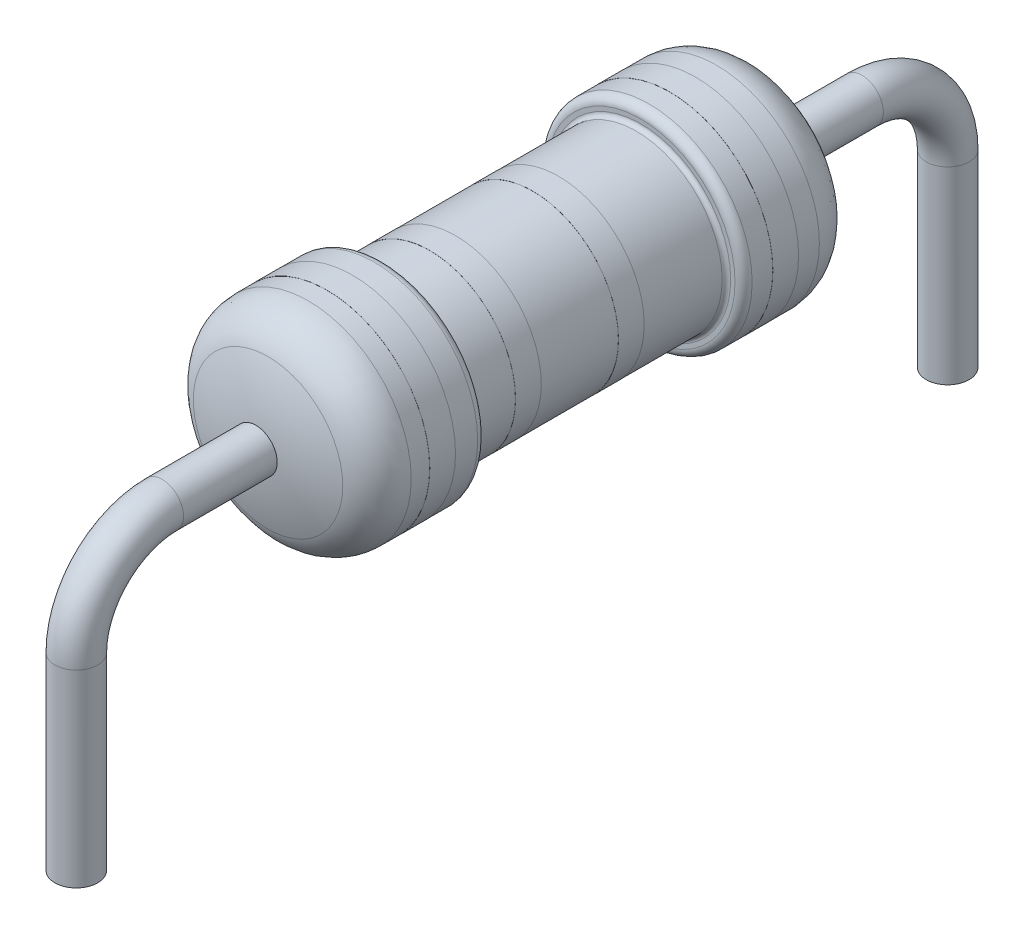
ISO-10303-21;
HEADER;
FILE_DESCRIPTION(('STEP AP214'),'2;1');
FILE_NAME('part.step','',(''),(''),'','','');
FILE_SCHEMA(('AUTOMOTIVE_DESIGN { 1 0 10303 214 1 1 1 1 }'));
ENDSEC;
DATA;
#1=APPLICATION_CONTEXT('core data for automotive mechanical design processes');
#2=APPLICATION_PROTOCOL_DEFINITION('international standard','automotive_design',2000,#1);
#3=PRODUCT_CONTEXT('',#1,'mechanical');
#4=PRODUCT('Part','Part','',(#3));
#5=PRODUCT_RELATED_PRODUCT_CATEGORY('part','',(#4));
#6=PRODUCT_DEFINITION_FORMATION('','',#4);
#7=PRODUCT_DEFINITION_CONTEXT('part definition',#1,'design');
#8=PRODUCT_DEFINITION('design','',#6,#7);
#9=PRODUCT_DEFINITION_SHAPE('','',#8);
#10=(LENGTH_UNIT() NAMED_UNIT(*) SI_UNIT(.MILLI.,.METRE.));
#11=(NAMED_UNIT(*) PLANE_ANGLE_UNIT() SI_UNIT($,.RADIAN.));
#12=(NAMED_UNIT(*) SI_UNIT($,.STERADIAN.) SOLID_ANGLE_UNIT());
#13=UNCERTAINTY_MEASURE_WITH_UNIT(LENGTH_MEASURE(1.E-05),#10,'distance_accuracy_value','');
#14=(GEOMETRIC_REPRESENTATION_CONTEXT(3) GLOBAL_UNCERTAINTY_ASSIGNED_CONTEXT((#13)) GLOBAL_UNIT_ASSIGNED_CONTEXT((#10,
#11,#12)) REPRESENTATION_CONTEXT('',''));
#15=CARTESIAN_POINT('',(0.,0.,0.));
#16=DIRECTION('',(0.,0.,1.));
#17=DIRECTION('',(1.,0.,0.));
#18=AXIS2_PLACEMENT_3D('',#15,#16,#17);
#19=CARTESIAN_POINT('',(0.,0.,13.0537184677986));
#20=DIRECTION('',(0.,0.,1.));
#21=DIRECTION('',(1.,0.,0.));
#22=AXIS2_PLACEMENT_3D('',#19,#20,#21);
#23=CYLINDRICAL_SURFACE('',#22,1.);
#24=CARTESIAN_POINT('',(0.,0.,-2.5));
#25=DIRECTION('',(0.,0.,1.));
#26=DIRECTION('',(1.,0.,0.));
#27=AXIS2_PLACEMENT_3D('',#24,#25,#26);
#28=CIRCLE('',#27,1.);
#29=CARTESIAN_POINT('',(1.,0.,-2.5));
#30=VERTEX_POINT('',#29);
#31=EDGE_CURVE('E627',#30,#30,#28,.T.);
#32=ORIENTED_EDGE('',*,*,#31,.T.);
#33=EDGE_LOOP('',(#32));
#34=FACE_BOUND('',#33,.T.);
#35=CARTESIAN_POINT('',(0.,0.,-1.6));
#36=DIRECTION('',(0.,0.,1.));
#37=DIRECTION('',(1.,0.,0.));
#38=AXIS2_PLACEMENT_3D('',#35,#36,#37);
#39=CIRCLE('',#38,1.);
#40=CARTESIAN_POINT('',(1.,0.,-1.6));
#41=VERTEX_POINT('',#40);
#42=EDGE_CURVE('E60',#41,#41,#39,.T.);
#43=ORIENTED_EDGE('',*,*,#42,.F.);
#44=EDGE_LOOP('',(#43));
#45=FACE_BOUND('',#44,.T.);
#46=ADVANCED_FACE('F50',(#34,#45),#23,.T.);
#47=CARTESIAN_POINT('',(0.,0.,-1.6));
#48=DIRECTION('',(0.,0.,1.));
#49=DIRECTION('',(1.,0.,0.));
#50=AXIS2_PLACEMENT_3D('',#47,#48,#49);
#51=CYLINDRICAL_SURFACE('',#50,1.001);
#52=CARTESIAN_POINT('',(0.,0.,-1.6));
#53=DIRECTION('',(0.,0.,1.));
#54=DIRECTION('',(1.,0.,0.));
#55=AXIS2_PLACEMENT_3D('',#52,#53,#54);
#56=CIRCLE('',#55,1.001);
#57=CARTESIAN_POINT('',(1.001,0.,-1.6));
#58=VERTEX_POINT('',#57);
#59=EDGE_CURVE('E296',#58,#58,#56,.T.);
#60=ORIENTED_EDGE('',*,*,#59,.T.);
#61=EDGE_LOOP('',(#60));
#62=FACE_BOUND('',#61,.T.);
#63=CARTESIAN_POINT('',(0.,0.,-1.3));
#64=DIRECTION('',(0.,0.,1.));
#65=DIRECTION('',(1.,0.,0.));
#66=AXIS2_PLACEMENT_3D('',#63,#64,#65);
#67=CIRCLE('',#66,1.001);
#68=CARTESIAN_POINT('',(1.001,0.,-1.3));
#69=VERTEX_POINT('',#68);
#70=EDGE_CURVE('E298',#69,#69,#67,.T.);
#71=ORIENTED_EDGE('',*,*,#70,.F.);
#72=EDGE_LOOP('',(#71));
#73=FACE_BOUND('',#72,.T.);
#74=ADVANCED_FACE('F212',(#62,#73),#51,.T.);
#75=CARTESIAN_POINT('',(0.,0.,-1.6));
#76=DIRECTION('',(0.,0.,1.));
#77=DIRECTION('',(1.,0.,0.));
#78=AXIS2_PLACEMENT_3D('',#75,#76,#77);
#79=PLANE('',#78);
#80=ORIENTED_EDGE('',*,*,#42,.T.);
#81=EDGE_LOOP('',(#80));
#82=FACE_BOUND('',#81,.T.);
#83=ORIENTED_EDGE('',*,*,#59,.F.);
#84=EDGE_LOOP('',(#83));
#85=FACE_BOUND('',#84,.T.);
#86=ADVANCED_FACE('F215',(#82,#85),#79,.F.);
#87=CARTESIAN_POINT('',(0.,0.,-1.3));
#88=DIRECTION('',(0.,0.,1.));
#89=DIRECTION('',(1.,0.,0.));
#90=AXIS2_PLACEMENT_3D('',#87,#88,#89);
#91=PLANE('',#90);
#92=CARTESIAN_POINT('',(0.,0.,-1.3));
#93=DIRECTION('',(0.,0.,1.));
#94=DIRECTION('',(1.,0.,0.));
#95=AXIS2_PLACEMENT_3D('',#92,#93,#94);
#96=CIRCLE('',#95,1.);
#97=CARTESIAN_POINT('',(1.,0.,-1.3));
#98=VERTEX_POINT('',#97);
#99=EDGE_CURVE('E306',#98,#98,#96,.T.);
#100=ORIENTED_EDGE('',*,*,#99,.F.);
#101=EDGE_LOOP('',(#100));
#102=FACE_BOUND('',#101,.T.);
#103=ORIENTED_EDGE('',*,*,#70,.T.);
#104=EDGE_LOOP('',(#103));
#105=FACE_BOUND('',#104,.T.);
#106=ADVANCED_FACE('F167',(#102,#105),#91,.T.);
#107=CARTESIAN_POINT('',(0.,-3.2,2.82076049666258));
#108=DIRECTION('',(0.,-1.,0.));
#109=DIRECTION('',(0.,0.,-1.));
#110=AXIS2_PLACEMENT_3D('',#107,#108,#109);
#111=PLANE('',#110);
#112=CARTESIAN_POINT('',(0.,-3.2,2.82076049666258));
#113=DIRECTION('',(0.,-1.,0.));
#114=DIRECTION('',(0.,0.,-1.));
#115=AXIS2_PLACEMENT_3D('',#112,#113,#114);
#116=CIRCLE('',#115,0.25);
#117=CARTESIAN_POINT('',(0.,-3.2,2.57076049666258));
#118=VERTEX_POINT('',#117);
#119=EDGE_CURVE('E65',#118,#118,#116,.T.);
#120=ORIENTED_EDGE('',*,*,#119,.T.);
#121=EDGE_LOOP('',(#120));
#122=FACE_BOUND('',#121,.T.);
#123=ADVANCED_FACE('F163',(#122),#111,.T.);
#124=CARTESIAN_POINT('',(0.,-3.2,2.82076049666258));
#125=DIRECTION('',(0.,1.,0.));
#126=DIRECTION('',(0.,0.,1.));
#127=AXIS2_PLACEMENT_3D('',#124,#125,#126);
#128=CYLINDRICAL_SURFACE('',#127,0.25);
#129=CARTESIAN_POINT('',(0.,-1.,2.82076049666258));
#130=DIRECTION('',(0.,-1.,0.));
#131=DIRECTION('',(0.,0.,-1.));
#132=AXIS2_PLACEMENT_3D('',#129,#130,#131);
#133=CIRCLE('',#132,0.25);
#134=CARTESIAN_POINT('',(0.,-1.,3.07076049666258));
#135=VERTEX_POINT('',#134);
#136=EDGE_CURVE('E332',#135,#135,#133,.T.);
#137=ORIENTED_EDGE('',*,*,#136,.T.);
#138=EDGE_LOOP('',(#137));
#139=FACE_BOUND('',#138,.T.);
#140=ORIENTED_EDGE('',*,*,#119,.F.);
#141=EDGE_LOOP('',(#140));
#142=FACE_BOUND('',#141,.T.);
#143=ADVANCED_FACE('F166',(#139,#142),#128,.T.);
#144=CARTESIAN_POINT('',(0.,-1.,1.82076049666258));
#145=DIRECTION('',(-1.,0.,0.));
#146=DIRECTION('',(0.,0.,1.));
#147=AXIS2_PLACEMENT_3D('',#144,#145,#146);
#148=TOROIDAL_SURFACE('',#147,1.,0.25);
#149=CARTESIAN_POINT('',(0.,0.,1.82076049666258));
#150=DIRECTION('',(0.,0.,1.));
#151=DIRECTION('',(0.,-1.,0.));
#152=AXIS2_PLACEMENT_3D('',#149,#150,#151);
#153=CIRCLE('',#152,0.25);
#154=CARTESIAN_POINT('',(0.,0.25,1.82076049666258));
#155=VERTEX_POINT('',#154);
#156=EDGE_CURVE('E336',#155,#155,#153,.T.);
#157=CARTESIAN_POINT('',(0.,-1.,1.82076049666258));
#158=DIRECTION('',(-1.,0.,0.));
#159=DIRECTION('',(0.,0.,1.));
#160=AXIS2_PLACEMENT_3D('',#157,#158,#159);
#161=CIRCLE('',#160,1.25);
#162=EDGE_CURVE('',#135,#155,#161,.T.);
#163=ORIENTED_EDGE('',*,*,#136,.F.);
#164=ORIENTED_EDGE('',*,*,#156,.T.);
#165=ORIENTED_EDGE('',*,*,#162,.T.);
#166=ORIENTED_EDGE('',*,*,#162,.F.);
#167=EDGE_LOOP('',(#163,#165,#164,#166));
#168=FACE_BOUND('',#167,.T.);
#169=ADVANCED_FACE('F182',(#168),#148,.T.);
#170=CARTESIAN_POINT('',(0.,0.,1.82076049666258));
#171=DIRECTION('',(0.,0.,-1.));
#172=DIRECTION('',(-1.,0.,0.));
#173=AXIS2_PLACEMENT_3D('',#170,#171,#172);
#174=CYLINDRICAL_SURFACE('',#173,0.25);
#175=ORIENTED_EDGE('',*,*,#156,.F.);
#176=EDGE_LOOP('',(#175));
#177=FACE_BOUND('',#176,.T.);
#178=CARTESIAN_POINT('',(0.,0.,0.728355418308152));
#179=DIRECTION('',(0.,0.,1.));
#180=DIRECTION('',(1.,0.,0.));
#181=AXIS2_PLACEMENT_3D('',#178,#179,#180);
#182=CIRCLE('',#181,0.25);
#183=CARTESIAN_POINT('',(0.25,0.,0.728355418308152));
#184=VERTEX_POINT('',#183);
#185=EDGE_CURVE('E89',#184,#184,#182,.T.);
#186=ORIENTED_EDGE('',*,*,#185,.T.);
#187=EDGE_LOOP('',(#186));
#188=FACE_BOUND('',#187,.T.);
#189=ADVANCED_FACE('F179',(#177,#188),#174,.T.);
#190=CARTESIAN_POINT('',(0.,0.871405633632315,0.585255019027252));
#191=CARTESIAN_POINT('',(0.,0.729361961211136,0.637090178239435));
#192=CARTESIAN_POINT('',(0.,0.44208401652609,0.714842917055385));
#193=CARTESIAN_POINT('',(0.,0.148424872124987,0.740760496662583));
#194=CARTESIAN_POINT('',(0.,0.,0.740760496662583));
#195=B_SPLINE_CURVE_WITH_KNOTS('',3,(#190,#191,#192,#193,#194),.UNSPECIFIED.,.F.,.F.,(4,1,4),
(0.,0.359983191317716,0.719966382635432),.UNSPECIFIED.);
#196=CARTESIAN_POINT('',(0.,0.,13.0537184677986));
#197=DIRECTION('',(0.,0.,1.));
#198=AXIS1_PLACEMENT('',#196,#197);
#199=SURFACE_OF_REVOLUTION('',#195,#198);
#200=CARTESIAN_POINT('',(0.,0.,0.585255019027252));
#201=DIRECTION('',(0.,0.,1.));
#202=DIRECTION('',(1.,0.,0.));
#203=AXIS2_PLACEMENT_3D('',#200,#201,#202);
#204=CIRCLE('',#203,0.871405633632315);
#205=CARTESIAN_POINT('',(0.871405633632315,0.,0.585255019027252));
#206=VERTEX_POINT('',#205);
#207=EDGE_CURVE('E74',#206,#206,#204,.T.);
#208=ORIENTED_EDGE('',*,*,#207,.T.);
#209=EDGE_LOOP('',(#208));
#210=FACE_BOUND('',#209,.T.);
#211=ORIENTED_EDGE('',*,*,#185,.F.);
#212=EDGE_LOOP('',(#211));
#213=FACE_BOUND('',#212,.T.);
#214=ADVANCED_FACE('F52',(#210,#213),#199,.T.);
#215=CARTESIAN_POINT('',(0.,0.,0.115552870044405));
#216=DIRECTION('',(0.,0.,1.));
#217=DIRECTION('',(1.,0.,0.));
#218=AXIS2_PLACEMENT_3D('',#215,#216,#217);
#219=TOROIDAL_SURFACE('',#218,0.7,0.5);
#220=ORIENTED_EDGE('',*,*,#207,.F.);
#221=EDGE_LOOP('',(#220));
#222=FACE_BOUND('',#221,.T.);
#223=CARTESIAN_POINT('',(0.,0.,0.115552870044404));
#224=DIRECTION('',(0.,0.,1.));
#225=DIRECTION('',(1.,0.,0.));
#226=AXIS2_PLACEMENT_3D('',#223,#224,#225);
#227=CIRCLE('',#226,1.2);
#228=CARTESIAN_POINT('',(1.2,0.,0.115552870044404));
#229=VERTEX_POINT('',#228);
#230=EDGE_CURVE('E81',#229,#229,#227,.T.);
#231=ORIENTED_EDGE('',*,*,#230,.T.);
#232=EDGE_LOOP('',(#231));
#233=FACE_BOUND('',#232,.T.);
#234=ADVANCED_FACE('F158',(#222,#233),#219,.T.);
#235=CARTESIAN_POINT('',(0.,0.,13.0537184677986));
#236=DIRECTION('',(0.,0.,1.));
#237=DIRECTION('',(1.,0.,0.));
#238=AXIS2_PLACEMENT_3D('',#235,#236,#237);
#239=CYLINDRICAL_SURFACE('',#238,1.2);
#240=CARTESIAN_POINT('',(0.,0.,-0.1));
#241=DIRECTION('',(0.,0.,1.));
#242=DIRECTION('',(1.,0.,0.));
#243=AXIS2_PLACEMENT_3D('',#240,#241,#242);
#244=CIRCLE('',#243,1.2);
#245=CARTESIAN_POINT('',(1.2,0.,-0.1));
#246=VERTEX_POINT('',#245);
#247=EDGE_CURVE('E315',#246,#246,#244,.T.);
#248=ORIENTED_EDGE('',*,*,#247,.T.);
#249=EDGE_LOOP('',(#248));
#250=FACE_BOUND('',#249,.T.);
#251=ORIENTED_EDGE('',*,*,#230,.F.);
#252=EDGE_LOOP('',(#251));
#253=FACE_BOUND('',#252,.T.);
#254=ADVANCED_FACE('F154',(#250,#253),#239,.T.);
#255=CARTESIAN_POINT('',(0.,0.,-0.1));
#256=DIRECTION('',(0.,0.,1.));
#257=DIRECTION('',(1.,0.,0.));
#258=AXIS2_PLACEMENT_3D('',#255,#256,#257);
#259=PLANE('',#258);
#260=ORIENTED_EDGE('',*,*,#247,.F.);
#261=EDGE_LOOP('',(#260));
#262=FACE_BOUND('',#261,.T.);
#263=CARTESIAN_POINT('',(0.,0.,-0.1));
#264=DIRECTION('',(0.,0.,1.));
#265=DIRECTION('',(1.,0.,0.));
#266=AXIS2_PLACEMENT_3D('',#263,#264,#265);
#267=CIRCLE('',#266,1.201);
#268=CARTESIAN_POINT('',(1.201,0.,-0.1));
#269=VERTEX_POINT('',#268);
#270=EDGE_CURVE('E322',#269,#269,#267,.T.);
#271=ORIENTED_EDGE('',*,*,#270,.T.);
#272=EDGE_LOOP('',(#271));
#273=FACE_BOUND('',#272,.T.);
#274=ADVANCED_FACE('F157',(#262,#273),#259,.T.);
#275=CARTESIAN_POINT('',(0.,0.,-0.4));
#276=DIRECTION('',(0.,0.,1.));
#277=DIRECTION('',(1.,0.,0.));
#278=AXIS2_PLACEMENT_3D('',#275,#276,#277);
#279=CYLINDRICAL_SURFACE('',#278,1.201);
#280=CARTESIAN_POINT('',(0.,0.,-0.4));
#281=DIRECTION('',(0.,0.,1.));
#282=DIRECTION('',(1.,0.,0.));
#283=AXIS2_PLACEMENT_3D('',#280,#281,#282);
#284=CIRCLE('',#283,1.201);
#285=CARTESIAN_POINT('',(1.201,0.,-0.4));
#286=VERTEX_POINT('',#285);
#287=EDGE_CURVE('E323',#286,#286,#284,.T.);
#288=ORIENTED_EDGE('',*,*,#287,.T.);
#289=EDGE_LOOP('',(#288));
#290=FACE_BOUND('',#289,.T.);
#291=ORIENTED_EDGE('',*,*,#270,.F.);
#292=EDGE_LOOP('',(#291));
#293=FACE_BOUND('',#292,.T.);
#294=ADVANCED_FACE('F190',(#290,#293),#279,.T.);
#295=CARTESIAN_POINT('',(0.,0.,-0.4));
#296=DIRECTION('',(0.,0.,1.));
#297=DIRECTION('',(1.,0.,0.));
#298=AXIS2_PLACEMENT_3D('',#295,#296,#297);
#299=PLANE('',#298);
#300=CARTESIAN_POINT('',(0.,0.,-0.399999999999999));
#301=DIRECTION('',(0.,0.,1.));
#302=DIRECTION('',(1.,0.,0.));
#303=AXIS2_PLACEMENT_3D('',#300,#301,#302);
#304=CIRCLE('',#303,1.2);
#305=CARTESIAN_POINT('',(1.2,0.,-0.399999999999999));
#306=VERTEX_POINT('',#305);
#307=EDGE_CURVE('E92',#306,#306,#304,.T.);
#308=ORIENTED_EDGE('',*,*,#307,.T.);
#309=EDGE_LOOP('',(#308));
#310=FACE_BOUND('',#309,.T.);
#311=ORIENTED_EDGE('',*,*,#287,.F.);
#312=EDGE_LOOP('',(#311));
#313=FACE_BOUND('',#312,.T.);
#314=ADVANCED_FACE('F193',(#310,#313),#299,.F.);
#315=CARTESIAN_POINT('',(0.,0.,-0.659239503337416));
#316=DIRECTION('',(0.,0.,1.));
#317=DIRECTION('',(1.,0.,0.));
#318=AXIS2_PLACEMENT_3D('',#315,#316,#317);
#319=CIRCLE('',#318,1.2);
#320=CARTESIAN_POINT('',(1.2,0.,-0.659239503337416));
#321=VERTEX_POINT('',#320);
#322=EDGE_CURVE('E600',#321,#321,#319,.T.);
#323=ORIENTED_EDGE('',*,*,#322,.T.);
#324=EDGE_LOOP('',(#323));
#325=FACE_BOUND('',#324,.T.);
#326=ORIENTED_EDGE('',*,*,#307,.F.);
#327=EDGE_LOOP('',(#326));
#328=FACE_BOUND('',#327,.T.);
#329=ADVANCED_FACE('F152',(#325,#328),#239,.T.);
#330=CARTESIAN_POINT('',(0.,0.,-0.659239503337417));
#331=DIRECTION('',(0.,0.,1.));
#332=DIRECTION('',(1.,0.,0.));
#333=AXIS2_PLACEMENT_3D('',#330,#331,#332);
#334=TOROIDAL_SURFACE('',#333,1.1,0.1);
#335=ORIENTED_EDGE('',*,*,#322,.F.);
#336=EDGE_LOOP('',(#335));
#337=FACE_BOUND('',#336,.T.);
#338=CARTESIAN_POINT('',(0.,0.,-0.759239503337417));
#339=DIRECTION('',(0.,0.,1.));
#340=DIRECTION('',(1.,0.,0.));
#341=AXIS2_PLACEMENT_3D('',#338,#339,#340);
#342=CIRCLE('',#341,1.1);
#343=CARTESIAN_POINT('',(1.1,0.,-0.759239503337417));
#344=VERTEX_POINT('',#343);
#345=EDGE_CURVE('E603',#344,#344,#342,.T.);
#346=ORIENTED_EDGE('',*,*,#345,.T.);
#347=EDGE_LOOP('',(#346));
#348=FACE_BOUND('',#347,.T.);
#349=ADVANCED_FACE('F148',(#337,#348),#334,.T.);
#350=CARTESIAN_POINT('',(0.,1.05,-0.759239503337417));
#351=DIRECTION('',(0.,0.,1.));
#352=DIRECTION('',(1.,0.,0.));
#353=AXIS2_PLACEMENT_3D('',#350,#351,#352);
#354=PLANE('',#353);
#355=ORIENTED_EDGE('',*,*,#345,.F.);
#356=EDGE_LOOP('',(#355));
#357=FACE_BOUND('',#356,.T.);
#358=CARTESIAN_POINT('',(0.,0.,-0.759239503337417));
#359=DIRECTION('',(0.,0.,1.));
#360=DIRECTION('',(1.,0.,0.));
#361=AXIS2_PLACEMENT_3D('',#358,#359,#360);
#362=CIRCLE('',#361,1.05);
#363=CARTESIAN_POINT('',(1.05,0.,-0.759239503337417));
#364=VERTEX_POINT('',#363);
#365=EDGE_CURVE('E261',#364,#364,#362,.T.);
#366=ORIENTED_EDGE('',*,*,#365,.T.);
#367=EDGE_LOOP('',(#366));
#368=FACE_BOUND('',#367,.T.);
#369=ADVANCED_FACE('F144',(#357,#368),#354,.F.);
#370=CARTESIAN_POINT('',(0.,0.,-0.809239503337417));
#371=DIRECTION('',(0.,0.,1.));
#372=DIRECTION('',(1.,0.,0.));
#373=AXIS2_PLACEMENT_3D('',#370,#371,#372);
#374=TOROIDAL_SURFACE('',#373,1.05,0.05);
#375=ORIENTED_EDGE('',*,*,#365,.F.);
#376=EDGE_LOOP('',(#375));
#377=FACE_BOUND('',#376,.T.);
#378=CARTESIAN_POINT('',(0.,0.,-0.809239503337417));
#379=DIRECTION('',(0.,0.,1.));
#380=DIRECTION('',(1.,0.,0.));
#381=AXIS2_PLACEMENT_3D('',#378,#379,#380);
#382=CIRCLE('',#381,1.);
#383=CARTESIAN_POINT('',(1.,0.,-0.809239503337417));
#384=VERTEX_POINT('',#383);
#385=EDGE_CURVE('E252',#384,#384,#382,.T.);
#386=ORIENTED_EDGE('',*,*,#385,.T.);
#387=EDGE_LOOP('',(#386));
#388=FACE_BOUND('',#387,.T.);
#389=ADVANCED_FACE('F140',(#377,#388),#374,.F.);
#390=ORIENTED_EDGE('',*,*,#99,.T.);
#391=EDGE_LOOP('',(#390));
#392=FACE_BOUND('',#391,.T.);
#393=ORIENTED_EDGE('',*,*,#385,.F.);
#394=EDGE_LOOP('',(#393));
#395=FACE_BOUND('',#394,.T.);
#396=ADVANCED_FACE('F136',(#392,#395),#23,.T.);
#397=CARTESIAN_POINT('',(0.,0.,-2.8));
#398=DIRECTION('',(0.,0.,1.));
#399=DIRECTION('',(1.,0.,0.));
#400=AXIS2_PLACEMENT_3D('',#397,#398,#399);
#401=CYLINDRICAL_SURFACE('',#400,1.001);
#402=CARTESIAN_POINT('',(0.,0.,-2.8));
#403=DIRECTION('',(0.,0.,1.));
#404=DIRECTION('',(1.,0.,0.));
#405=AXIS2_PLACEMENT_3D('',#402,#403,#404);
#406=CIRCLE('',#405,1.001);
#407=CARTESIAN_POINT('',(1.001,0.,-2.8));
#408=VERTEX_POINT('',#407);
#409=EDGE_CURVE('E619',#408,#408,#406,.T.);
#410=ORIENTED_EDGE('',*,*,#409,.T.);
#411=EDGE_LOOP('',(#410));
#412=FACE_BOUND('',#411,.T.);
#413=CARTESIAN_POINT('',(0.,0.,-2.5));
#414=DIRECTION('',(0.,0.,1.));
#415=DIRECTION('',(1.,0.,0.));
#416=AXIS2_PLACEMENT_3D('',#413,#414,#415);
#417=CIRCLE('',#416,1.001);
#418=CARTESIAN_POINT('',(1.001,0.,-2.5));
#419=VERTEX_POINT('',#418);
#420=EDGE_CURVE('E622',#419,#419,#417,.T.);
#421=ORIENTED_EDGE('',*,*,#420,.F.);
#422=EDGE_LOOP('',(#421));
#423=FACE_BOUND('',#422,.T.);
#424=ADVANCED_FACE('F139',(#412,#423),#401,.T.);
#425=CARTESIAN_POINT('',(0.,0.,-2.8));
#426=DIRECTION('',(0.,0.,1.));
#427=DIRECTION('',(1.,0.,0.));
#428=AXIS2_PLACEMENT_3D('',#425,#426,#427);
#429=PLANE('',#428);
#430=CARTESIAN_POINT('',(0.,0.,-2.8));
#431=DIRECTION('',(0.,0.,1.));
#432=DIRECTION('',(1.,0.,0.));
#433=AXIS2_PLACEMENT_3D('',#430,#431,#432);
#434=CIRCLE('',#433,1.);
#435=CARTESIAN_POINT('',(1.,0.,-2.8));
#436=VERTEX_POINT('',#435);
#437=EDGE_CURVE('E12',#436,#436,#434,.T.);
#438=ORIENTED_EDGE('',*,*,#437,.T.);
#439=EDGE_LOOP('',(#438));
#440=FACE_BOUND('',#439,.T.);
#441=ORIENTED_EDGE('',*,*,#409,.F.);
#442=EDGE_LOOP('',(#441));
#443=FACE_BOUND('',#442,.T.);
#444=ADVANCED_FACE('F225',(#440,#443),#429,.F.);
#445=CARTESIAN_POINT('',(0.,0.,-2.5));
#446=DIRECTION('',(0.,0.,1.));
#447=DIRECTION('',(1.,0.,0.));
#448=AXIS2_PLACEMENT_3D('',#445,#446,#447);
#449=PLANE('',#448);
#450=ORIENTED_EDGE('',*,*,#31,.F.);
#451=EDGE_LOOP('',(#450));
#452=FACE_BOUND('',#451,.T.);
#453=ORIENTED_EDGE('',*,*,#420,.T.);
#454=EDGE_LOOP('',(#453));
#455=FACE_BOUND('',#454,.T.);
#456=ADVANCED_FACE('F172',(#452,#455),#449,.T.);
#457=CARTESIAN_POINT('',(0.,-3.2,-7.33923950333742));
#458=DIRECTION('',(0.,1.,0.));
#459=DIRECTION('',(0.,0.,1.));
#460=AXIS2_PLACEMENT_3D('',#457,#458,#459);
#461=PLANE('',#460);
#462=CARTESIAN_POINT('',(0.,-3.2,-7.33923950333742));
#463=DIRECTION('',(0.,1.,0.));
#464=DIRECTION('',(0.,0.,1.));
#465=AXIS2_PLACEMENT_3D('',#462,#463,#464);
#466=CIRCLE('',#465,0.25);
#467=CARTESIAN_POINT('',(0.,-3.2,-7.08923950333742));
#468=VERTEX_POINT('',#467);
#469=EDGE_CURVE('E69',#468,#468,#466,.T.);
#470=ORIENTED_EDGE('',*,*,#469,.F.);
#471=EDGE_LOOP('',(#470));
#472=FACE_BOUND('',#471,.T.);
#473=ADVANCED_FACE('F169',(#472),#461,.F.);
#474=CARTESIAN_POINT('',(0.,-1.,-7.33923950333742));
#475=DIRECTION('',(0.,-1.,0.));
#476=DIRECTION('',(0.,0.,-1.));
#477=AXIS2_PLACEMENT_3D('',#474,#475,#476);
#478=CYLINDRICAL_SURFACE('',#477,0.25);
#479=ORIENTED_EDGE('',*,*,#469,.T.);
#480=EDGE_LOOP('',(#479));
#481=FACE_BOUND('',#480,.T.);
#482=CARTESIAN_POINT('',(0.,-1.,-7.33923950333742));
#483=DIRECTION('',(0.,1.,0.));
#484=DIRECTION('',(0.,0.,1.));
#485=AXIS2_PLACEMENT_3D('',#482,#483,#484);
#486=CIRCLE('',#485,0.25);
#487=CARTESIAN_POINT('',(0.,-1.,-7.58923950333742));
#488=VERTEX_POINT('',#487);
#489=EDGE_CURVE('E75',#488,#488,#486,.T.);
#490=ORIENTED_EDGE('',*,*,#489,.F.);
#491=EDGE_LOOP('',(#490));
#492=FACE_BOUND('',#491,.T.);
#493=ADVANCED_FACE('F70',(#481,#492),#478,.T.);
#494=CARTESIAN_POINT('',(0.,-1.,-6.33923950333742));
#495=DIRECTION('',(-1.,0.,0.));
#496=DIRECTION('',(0.,0.,1.));
#497=AXIS2_PLACEMENT_3D('',#494,#495,#496);
#498=TOROIDAL_SURFACE('',#497,1.,0.25);
#499=CARTESIAN_POINT('',(0.,0.,-6.33923950333742));
#500=DIRECTION('',(0.,0.,1.));
#501=DIRECTION('',(0.,-1.,0.));
#502=AXIS2_PLACEMENT_3D('',#499,#500,#501);
#503=CIRCLE('',#502,0.25);
#504=CARTESIAN_POINT('',(0.,0.25,-6.33923950333742));
#505=VERTEX_POINT('',#504);
#506=EDGE_CURVE('E85',#505,#505,#503,.T.);
#507=CARTESIAN_POINT('',(0.,-1.,-6.33923950333742));
#508=DIRECTION('',(-1.,0.,0.));
#509=DIRECTION('',(0.,0.,1.));
#510=AXIS2_PLACEMENT_3D('',#507,#508,#509);
#511=CIRCLE('',#510,1.25);
#512=EDGE_CURVE('',#505,#488,#511,.T.);
#513=ORIENTED_EDGE('',*,*,#506,.F.);
#514=ORIENTED_EDGE('',*,*,#489,.T.);
#515=ORIENTED_EDGE('',*,*,#512,.T.);
#516=ORIENTED_EDGE('',*,*,#512,.F.);
#517=EDGE_LOOP('',(#513,#515,#514,#516));
#518=FACE_BOUND('',#517,.T.);
#519=ADVANCED_FACE('F175',(#518),#498,.T.);
#520=ORIENTED_EDGE('',*,*,#506,.T.);
#521=EDGE_LOOP('',(#520));
#522=FACE_BOUND('',#521,.T.);
#523=CARTESIAN_POINT('',(0.,0.,-5.24920735937438));
#524=DIRECTION('',(0.,0.,1.));
#525=DIRECTION('',(1.,0.,0.));
#526=AXIS2_PLACEMENT_3D('',#523,#524,#525);
#527=CIRCLE('',#526,0.25);
#528=CARTESIAN_POINT('',(0.25,0.,-5.24920735937438));
#529=VERTEX_POINT('',#528);
#530=EDGE_CURVE('E93',#529,#529,#527,.F.);
#531=ORIENTED_EDGE('',*,*,#530,.T.);
#532=EDGE_LOOP('',(#531));
#533=FACE_BOUND('',#532,.T.);
#534=ADVANCED_FACE('F112',(#522,#533),#174,.T.);
#535=CARTESIAN_POINT('',(0.,0.,-5.25923950333742));
#536=CARTESIAN_POINT('',(0.,0.163059125996527,-5.25923950333742));
#537=CARTESIAN_POINT('',(0.,0.441306861524513,-5.23835919856229));
#538=CARTESIAN_POINT('',(0.,0.744515697397524,-5.15977721254951));
#539=CARTESIAN_POINT('',(0.,0.873310117120004,-5.11218394202155));
#540=B_SPLINE_CURVE_WITH_KNOTS('',3,(#535,#536,#537,#538,#539),.UNSPECIFIED.,.F.,.F.,(4,1,4),
(0.299867723650735,0.66011229494991,1.),.UNSPECIFIED.);
#541=CARTESIAN_POINT('',(0.,0.,13.0537184677986));
#542=DIRECTION('',(0.,0.,1.));
#543=AXIS1_PLACEMENT('',#541,#542);
#544=SURFACE_OF_REVOLUTION('',#540,#543);
#545=CARTESIAN_POINT('',(0.,0.,-5.11218394202155));
#546=DIRECTION('',(0.,0.,1.));
#547=DIRECTION('',(1.,0.,0.));
#548=AXIS2_PLACEMENT_3D('',#545,#546,#547);
#549=CIRCLE('',#548,0.873310117120004);
#550=CARTESIAN_POINT('',(0.873310117120004,0.,-5.11218394202155));
#551=VERTEX_POINT('',#550);
#552=EDGE_CURVE('E276',#551,#551,#549,.T.);
#553=ORIENTED_EDGE('',*,*,#552,.F.);
#554=EDGE_LOOP('',(#553));
#555=FACE_BOUND('',#554,.T.);
#556=ORIENTED_EDGE('',*,*,#530,.F.);
#557=EDGE_LOOP('',(#556));
#558=FACE_BOUND('',#557,.T.);
#559=ADVANCED_FACE('F108',(#555,#558),#544,.T.);
#560=CARTESIAN_POINT('',(0.,0.,-4.64318116665252));
#561=DIRECTION('',(0.,0.,1.));
#562=DIRECTION('',(1.,0.,0.));
#563=AXIS2_PLACEMENT_3D('',#560,#561,#562);
#564=TOROIDAL_SURFACE('',#563,0.7,0.499999999999999);
#565=CARTESIAN_POINT('',(0.,0.,-4.64318116665252));
#566=DIRECTION('',(0.,0.,1.));
#567=DIRECTION('',(1.,0.,0.));
#568=AXIS2_PLACEMENT_3D('',#565,#566,#567);
#569=CIRCLE('',#568,1.2);
#570=CARTESIAN_POINT('',(1.2,0.,-4.64318116665252));
#571=VERTEX_POINT('',#570);
#572=EDGE_CURVE('E272',#571,#571,#569,.T.);
#573=ORIENTED_EDGE('',*,*,#572,.F.);
#574=EDGE_LOOP('',(#573));
#575=FACE_BOUND('',#574,.T.);
#576=ORIENTED_EDGE('',*,*,#552,.T.);
#577=EDGE_LOOP('',(#576));
#578=FACE_BOUND('',#577,.T.);
#579=ADVANCED_FACE('F111',(#575,#578),#564,.T.);
#580=CARTESIAN_POINT('',(0.,0.,13.0537184677986));
#581=DIRECTION('',(0.,0.,1.));
#582=DIRECTION('',(1.,0.,0.));
#583=AXIS2_PLACEMENT_3D('',#580,#581,#582);
#584=CYLINDRICAL_SURFACE('',#583,1.2);
#585=ORIENTED_EDGE('',*,*,#572,.T.);
#586=EDGE_LOOP('',(#585));
#587=FACE_BOUND('',#586,.T.);
#588=CARTESIAN_POINT('',(0.,0.,-4.4));
#589=DIRECTION('',(0.,0.,1.));
#590=DIRECTION('',(1.,0.,0.));
#591=AXIS2_PLACEMENT_3D('',#588,#589,#590);
#592=CIRCLE('',#591,1.2);
#593=CARTESIAN_POINT('',(1.2,0.,-4.4));
#594=VERTEX_POINT('',#593);
#595=EDGE_CURVE('E285',#594,#594,#592,.T.);
#596=ORIENTED_EDGE('',*,*,#595,.F.);
#597=EDGE_LOOP('',(#596));
#598=FACE_BOUND('',#597,.T.);
#599=ADVANCED_FACE('F116',(#587,#598),#584,.T.);
#600=CARTESIAN_POINT('',(0.,0.,-4.4));
#601=DIRECTION('',(0.,0.,1.));
#602=DIRECTION('',(1.,0.,0.));
#603=AXIS2_PLACEMENT_3D('',#600,#601,#602);
#604=PLANE('',#603);
#605=ORIENTED_EDGE('',*,*,#595,.T.);
#606=EDGE_LOOP('',(#605));
#607=FACE_BOUND('',#606,.T.);
#608=CARTESIAN_POINT('',(0.,0.,-4.4));
#609=DIRECTION('',(0.,0.,1.));
#610=DIRECTION('',(1.,0.,0.));
#611=AXIS2_PLACEMENT_3D('',#608,#609,#610);
#612=CIRCLE('',#611,1.201);
#613=CARTESIAN_POINT('',(1.201,0.,-4.4));
#614=VERTEX_POINT('',#613);
#615=EDGE_CURVE('E311',#614,#614,#612,.T.);
#616=ORIENTED_EDGE('',*,*,#615,.F.);
#617=EDGE_LOOP('',(#616));
#618=FACE_BOUND('',#617,.T.);
#619=ADVANCED_FACE('F204',(#607,#618),#604,.F.);
#620=CARTESIAN_POINT('',(0.,0.,-4.4));
#621=DIRECTION('',(0.,0.,1.));
#622=DIRECTION('',(1.,0.,0.));
#623=AXIS2_PLACEMENT_3D('',#620,#621,#622);
#624=CYLINDRICAL_SURFACE('',#623,1.201);
#625=ORIENTED_EDGE('',*,*,#615,.T.);
#626=EDGE_LOOP('',(#625));
#627=FACE_BOUND('',#626,.T.);
#628=CARTESIAN_POINT('',(0.,0.,-4.1));
#629=DIRECTION('',(0.,0.,1.));
#630=DIRECTION('',(1.,0.,0.));
#631=AXIS2_PLACEMENT_3D('',#628,#629,#630);
#632=CIRCLE('',#631,1.201);
#633=CARTESIAN_POINT('',(1.201,0.,-4.1));
#634=VERTEX_POINT('',#633);
#635=EDGE_CURVE('E302',#634,#634,#632,.T.);
#636=ORIENTED_EDGE('',*,*,#635,.F.);
#637=EDGE_LOOP('',(#636));
#638=FACE_BOUND('',#637,.T.);
#639=ADVANCED_FACE('F201',(#627,#638),#624,.T.);
#640=CARTESIAN_POINT('',(0.,0.,-4.1));
#641=DIRECTION('',(0.,0.,1.));
#642=DIRECTION('',(1.,0.,0.));
#643=AXIS2_PLACEMENT_3D('',#640,#641,#642);
#644=PLANE('',#643);
#645=CARTESIAN_POINT('',(0.,0.,-4.1));
#646=DIRECTION('',(0.,0.,1.));
#647=DIRECTION('',(1.,0.,0.));
#648=AXIS2_PLACEMENT_3D('',#645,#646,#647);
#649=CIRCLE('',#648,1.2);
#650=CARTESIAN_POINT('',(1.2,0.,-4.1));
#651=VERTEX_POINT('',#650);
#652=EDGE_CURVE('E297',#651,#651,#649,.T.);
#653=ORIENTED_EDGE('',*,*,#652,.F.);
#654=EDGE_LOOP('',(#653));
#655=FACE_BOUND('',#654,.T.);
#656=ORIENTED_EDGE('',*,*,#635,.T.);
#657=EDGE_LOOP('',(#656));
#658=FACE_BOUND('',#657,.T.);
#659=ADVANCED_FACE('F122',(#655,#658),#644,.T.);
#660=ORIENTED_EDGE('',*,*,#652,.T.);
#661=EDGE_LOOP('',(#660));
#662=FACE_BOUND('',#661,.T.);
#663=CARTESIAN_POINT('',(0.,0.,-3.85923950333742));
#664=DIRECTION('',(0.,0.,1.));
#665=DIRECTION('',(1.,0.,0.));
#666=AXIS2_PLACEMENT_3D('',#663,#664,#665);
#667=CIRCLE('',#666,1.2);
#668=CARTESIAN_POINT('',(1.2,0.,-3.85923950333742));
#669=VERTEX_POINT('',#668);
#670=EDGE_CURVE('E268',#669,#669,#667,.T.);
#671=ORIENTED_EDGE('',*,*,#670,.F.);
#672=EDGE_LOOP('',(#671));
#673=FACE_BOUND('',#672,.T.);
#674=ADVANCED_FACE('F118',(#662,#673),#584,.T.);
#675=CARTESIAN_POINT('',(0.,0.,-3.85923950333742));
#676=DIRECTION('',(0.,0.,1.));
#677=DIRECTION('',(1.,0.,0.));
#678=AXIS2_PLACEMENT_3D('',#675,#676,#677);
#679=TOROIDAL_SURFACE('',#678,1.1,0.0999999999999999);
#680=CARTESIAN_POINT('',(0.,0.,-3.75923950333742));
#681=DIRECTION('',(0.,0.,1.));
#682=DIRECTION('',(1.,0.,0.));
#683=AXIS2_PLACEMENT_3D('',#680,#681,#682);
#684=CIRCLE('',#683,1.1);
#685=CARTESIAN_POINT('',(1.1,0.,-3.75923950333742));
#686=VERTEX_POINT('',#685);
#687=EDGE_CURVE('E257',#686,#686,#684,.T.);
#688=ORIENTED_EDGE('',*,*,#687,.F.);
#689=EDGE_LOOP('',(#688));
#690=FACE_BOUND('',#689,.T.);
#691=ORIENTED_EDGE('',*,*,#670,.T.);
#692=EDGE_LOOP('',(#691));
#693=FACE_BOUND('',#692,.T.);
#694=ADVANCED_FACE('F121',(#690,#693),#679,.T.);
#695=CARTESIAN_POINT('',(0.,1.05,-3.75923950333742));
#696=DIRECTION('',(0.,0.,-1.));
#697=DIRECTION('',(-1.,0.,0.));
#698=AXIS2_PLACEMENT_3D('',#695,#696,#697);
#699=PLANE('',#698);
#700=CARTESIAN_POINT('',(0.,0.,-3.75923950333742));
#701=DIRECTION('',(0.,0.,1.));
#702=DIRECTION('',(1.,0.,0.));
#703=AXIS2_PLACEMENT_3D('',#700,#701,#702);
#704=CIRCLE('',#703,1.05);
#705=CARTESIAN_POINT('',(1.05,0.,-3.75923950333742));
#706=VERTEX_POINT('',#705);
#707=EDGE_CURVE('E251',#706,#706,#704,.T.);
#708=ORIENTED_EDGE('',*,*,#707,.F.);
#709=EDGE_LOOP('',(#708));
#710=FACE_BOUND('',#709,.T.);
#711=ORIENTED_EDGE('',*,*,#687,.T.);
#712=EDGE_LOOP('',(#711));
#713=FACE_BOUND('',#712,.T.);
#714=ADVANCED_FACE('F126',(#710,#713),#699,.F.);
#715=CARTESIAN_POINT('',(0.,0.,-3.70923950333742));
#716=DIRECTION('',(0.,0.,1.));
#717=DIRECTION('',(1.,0.,0.));
#718=AXIS2_PLACEMENT_3D('',#715,#716,#717);
#719=TOROIDAL_SURFACE('',#718,1.05,0.05);
#720=CARTESIAN_POINT('',(0.,0.,-3.70923950333742));
#721=DIRECTION('',(0.,0.,1.));
#722=DIRECTION('',(1.,0.,0.));
#723=AXIS2_PLACEMENT_3D('',#720,#721,#722);
#724=CIRCLE('',#723,1.);
#725=CARTESIAN_POINT('',(1.,0.,-3.70923950333742));
#726=VERTEX_POINT('',#725);
#727=EDGE_CURVE('E248',#726,#726,#724,.T.);
#728=ORIENTED_EDGE('',*,*,#727,.F.);
#729=EDGE_LOOP('',(#728));
#730=FACE_BOUND('',#729,.T.);
#731=ORIENTED_EDGE('',*,*,#707,.T.);
#732=EDGE_LOOP('',(#731));
#733=FACE_BOUND('',#732,.T.);
#734=ADVANCED_FACE('F130',(#730,#733),#719,.F.);
#735=ORIENTED_EDGE('',*,*,#727,.T.);
#736=EDGE_LOOP('',(#735));
#737=FACE_BOUND('',#736,.T.);
#738=ORIENTED_EDGE('',*,*,#437,.F.);
#739=EDGE_LOOP('',(#738));
#740=FACE_BOUND('',#739,.T.);
#741=ADVANCED_FACE('F134',(#737,#740),#23,.T.);
#742=CLOSED_SHELL('',(#46,#74,#86,#106,#123,#143,#169,#189,#214,#234,#254,#274,#294,#314,#329,
#349,#369,#389,#396,#424,#444,#456,#473,#493,#519,#534,#559,#579,#599,#619,#639,#659,#674,#694,
#714,#734,#741));
#743=MANIFOLD_SOLID_BREP('B2',#742);
#744=ADVANCED_BREP_SHAPE_REPRESENTATION('',(#18,#743),#14);
#745=SHAPE_DEFINITION_REPRESENTATION(#9,#744);
ENDSEC;
END-ISO-10303-21;
